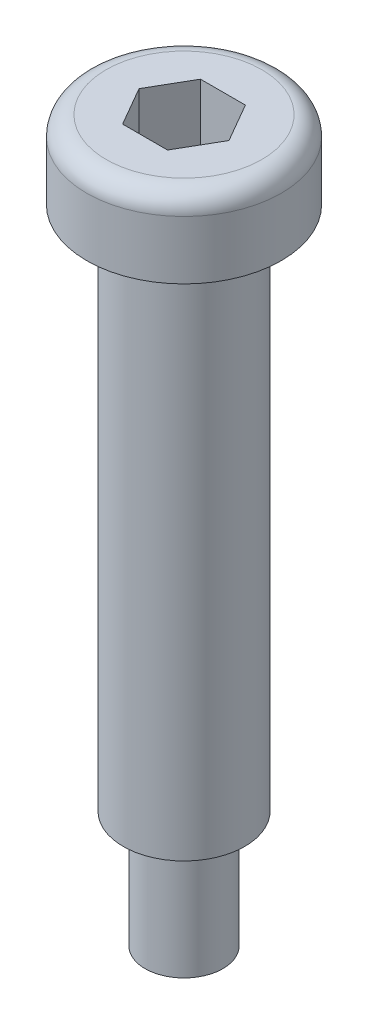
ISO-10303-21;
HEADER;
FILE_DESCRIPTION(('STEP AP214'),'2;1');
FILE_NAME('part.step','',(''),(''),'','','');
FILE_SCHEMA(('AUTOMOTIVE_DESIGN { 1 0 10303 214 1 1 1 1 }'));
ENDSEC;
DATA;
#1=APPLICATION_CONTEXT('core data for automotive mechanical design processes');
#2=APPLICATION_PROTOCOL_DEFINITION('international standard','automotive_design',2000,#1);
#3=PRODUCT_CONTEXT('',#1,'mechanical');
#4=PRODUCT('Part','Part','',(#3));
#5=PRODUCT_RELATED_PRODUCT_CATEGORY('part','',(#4));
#6=PRODUCT_DEFINITION_FORMATION('','',#4);
#7=PRODUCT_DEFINITION_CONTEXT('part definition',#1,'design');
#8=PRODUCT_DEFINITION('design','',#6,#7);
#9=PRODUCT_DEFINITION_SHAPE('','',#8);
#10=(LENGTH_UNIT() NAMED_UNIT(*) SI_UNIT(.MILLI.,.METRE.));
#11=(NAMED_UNIT(*) PLANE_ANGLE_UNIT() SI_UNIT($,.RADIAN.));
#12=(NAMED_UNIT(*) SI_UNIT($,.STERADIAN.) SOLID_ANGLE_UNIT());
#13=UNCERTAINTY_MEASURE_WITH_UNIT(LENGTH_MEASURE(1.E-05),#10,'distance_accuracy_value','');
#14=(GEOMETRIC_REPRESENTATION_CONTEXT(3) GLOBAL_UNCERTAINTY_ASSIGNED_CONTEXT((#13)) GLOBAL_UNIT_ASSIGNED_CONTEXT((#10,
#11,#12)) REPRESENTATION_CONTEXT('',''));
#15=CARTESIAN_POINT('',(0.,0.,0.));
#16=DIRECTION('',(0.,0.,1.));
#17=DIRECTION('',(1.,0.,0.));
#18=AXIS2_PLACEMENT_3D('',#15,#16,#17);
#19=CARTESIAN_POINT('',(-2.,0.,0.));
#20=DIRECTION('',(0.,1.,0.));
#21=DIRECTION('',(0.,0.,1.));
#22=AXIS2_PLACEMENT_3D('',#19,#20,#21);
#23=PLANE('',#22);
#24=CARTESIAN_POINT('',(0.,0.,0.));
#25=DIRECTION('',(0.,-1.,0.));
#26=DIRECTION('',(0.,0.,-1.));
#27=AXIS2_PLACEMENT_3D('',#24,#25,#26);
#28=CIRCLE('',#27,2.);
#29=CARTESIAN_POINT('',(0.,0.,-2.));
#30=VERTEX_POINT('',#29);
#31=EDGE_CURVE('E160',#30,#30,#28,.T.);
#32=ORIENTED_EDGE('',*,*,#31,.T.);
#33=EDGE_LOOP('',(#32));
#34=FACE_BOUND('',#33,.T.);
#35=ADVANCED_FACE('F45',(#34),#23,.F.);
#36=CARTESIAN_POINT('',(0.,37.,0.));
#37=DIRECTION('',(0.,-1.,0.));
#38=DIRECTION('',(0.,0.,-1.));
#39=AXIS2_PLACEMENT_3D('',#36,#37,#38);
#40=PLANE('',#39);
#41=CARTESIAN_POINT('',(0.,37.,0.));
#42=DIRECTION('',(0.,-1.,0.));
#43=DIRECTION('',(0.,0.,-1.));
#44=AXIS2_PLACEMENT_3D('',#41,#42,#43);
#45=CIRCLE('',#44,4.);
#46=CARTESIAN_POINT('',(0.,37.,-4.));
#47=VERTEX_POINT('',#46);
#48=EDGE_CURVE('E11',#47,#47,#45,.F.);
#49=ORIENTED_EDGE('',*,*,#48,.T.);
#50=EDGE_LOOP('',(#49));
#51=FACE_BOUND('',#50,.T.);
#52=DIRECTION('',(-1.,0.,0.));
#53=VECTOR('',#52,1.);
#54=CARTESIAN_POINT('',(1.15470053837925,37.,-2.));
#55=LINE('',#54,#53);
#56=CARTESIAN_POINT('',(1.15470053837925,37.,-2.));
#57=VERTEX_POINT('',#56);
#58=CARTESIAN_POINT('',(-1.15470053837925,37.,-2.));
#59=VERTEX_POINT('',#58);
#60=EDGE_CURVE('E141',#57,#59,#55,.T.);
#61=ORIENTED_EDGE('',*,*,#60,.F.);
#62=DIRECTION('',(-0.5,0.,-0.866025403784438));
#63=VECTOR('',#62,1.);
#64=CARTESIAN_POINT('',(2.3094010767585,37.,0.));
#65=LINE('',#64,#63);
#66=CARTESIAN_POINT('',(2.3094010767585,37.,0.));
#67=VERTEX_POINT('',#66);
#68=EDGE_CURVE('E61',#67,#57,#65,.T.);
#69=ORIENTED_EDGE('',*,*,#68,.F.);
#70=DIRECTION('',(0.5,0.,-0.866025403784439));
#71=VECTOR('',#70,1.);
#72=CARTESIAN_POINT('',(1.15470053837925,37.,2.));
#73=LINE('',#72,#71);
#74=CARTESIAN_POINT('',(1.15470053837925,37.,2.));
#75=VERTEX_POINT('',#74);
#76=EDGE_CURVE('E154',#75,#67,#73,.T.);
#77=ORIENTED_EDGE('',*,*,#76,.F.);
#78=DIRECTION('',(1.,0.,0.));
#79=VECTOR('',#78,1.);
#80=CARTESIAN_POINT('',(-1.15470053837925,37.,2.));
#81=LINE('',#80,#79);
#82=CARTESIAN_POINT('',(-1.15470053837925,37.,2.));
#83=VERTEX_POINT('',#82);
#84=EDGE_CURVE('E151',#83,#75,#81,.T.);
#85=ORIENTED_EDGE('',*,*,#84,.F.);
#86=DIRECTION('',(0.5,0.,0.866025403784439));
#87=VECTOR('',#86,1.);
#88=CARTESIAN_POINT('',(-2.3094010767585,37.,0.));
#89=LINE('',#88,#87);
#90=CARTESIAN_POINT('',(-2.3094010767585,37.,0.));
#91=VERTEX_POINT('',#90);
#92=EDGE_CURVE('E109',#91,#83,#89,.T.);
#93=ORIENTED_EDGE('',*,*,#92,.F.);
#94=DIRECTION('',(-0.5,0.,0.866025403784439));
#95=VECTOR('',#94,1.);
#96=CARTESIAN_POINT('',(-1.15470053837925,37.,-2.));
#97=LINE('',#96,#95);
#98=EDGE_CURVE('E145',#59,#91,#97,.T.);
#99=ORIENTED_EDGE('',*,*,#98,.F.);
#100=EDGE_LOOP('',(#61,#69,#77,#85,#93,#99));
#101=FACE_BOUND('',#100,.T.);
#102=ADVANCED_FACE('F205',(#51,#101),#40,.F.);
#103=CARTESIAN_POINT('',(0.,0.,0.));
#104=DIRECTION('',(0.,-1.,0.));
#105=DIRECTION('',(0.,0.,-1.));
#106=AXIS2_PLACEMENT_3D('',#103,#104,#105);
#107=CYLINDRICAL_SURFACE('',#106,5.);
#108=CARTESIAN_POINT('',(0.,36.,0.));
#109=DIRECTION('',(0.,-1.,0.));
#110=DIRECTION('',(0.,0.,-1.));
#111=AXIS2_PLACEMENT_3D('',#108,#109,#110);
#112=CIRCLE('',#111,5.);
#113=CARTESIAN_POINT('',(0.,36.,-5.));
#114=VERTEX_POINT('',#113);
#115=EDGE_CURVE('E54',#114,#114,#112,.T.);
#116=ORIENTED_EDGE('',*,*,#115,.T.);
#117=EDGE_LOOP('',(#116));
#118=FACE_BOUND('',#117,.T.);
#119=CARTESIAN_POINT('',(0.,33.,0.));
#120=DIRECTION('',(0.,-1.,0.));
#121=DIRECTION('',(0.,0.,-1.));
#122=AXIS2_PLACEMENT_3D('',#119,#120,#121);
#123=CIRCLE('',#122,5.);
#124=CARTESIAN_POINT('',(0.,33.,-5.));
#125=VERTEX_POINT('',#124);
#126=EDGE_CURVE('E185',#125,#125,#123,.T.);
#127=ORIENTED_EDGE('',*,*,#126,.F.);
#128=EDGE_LOOP('',(#127));
#129=FACE_BOUND('',#128,.T.);
#130=ADVANCED_FACE('F192',(#118,#129),#107,.T.);
#131=CARTESIAN_POINT('',(-5.,33.,0.));
#132=DIRECTION('',(0.,1.,0.));
#133=DIRECTION('',(0.,0.,1.));
#134=AXIS2_PLACEMENT_3D('',#131,#132,#133);
#135=PLANE('',#134);
#136=CARTESIAN_POINT('',(0.,33.,0.));
#137=DIRECTION('',(0.,-1.,0.));
#138=DIRECTION('',(0.,0.,-1.));
#139=AXIS2_PLACEMENT_3D('',#136,#137,#138);
#140=CIRCLE('',#139,3.125);
#141=CARTESIAN_POINT('',(0.,33.,-3.125));
#142=VERTEX_POINT('',#141);
#143=EDGE_CURVE('E181',#142,#142,#140,.T.);
#144=ORIENTED_EDGE('',*,*,#143,.F.);
#145=EDGE_LOOP('',(#144));
#146=FACE_BOUND('',#145,.T.);
#147=ORIENTED_EDGE('',*,*,#126,.T.);
#148=EDGE_LOOP('',(#147));
#149=FACE_BOUND('',#148,.T.);
#150=ADVANCED_FACE('F215',(#146,#149),#135,.F.);
#151=CARTESIAN_POINT('',(0.,0.,0.));
#152=DIRECTION('',(0.,-1.,0.));
#153=DIRECTION('',(0.,0.,-1.));
#154=AXIS2_PLACEMENT_3D('',#151,#152,#153);
#155=CYLINDRICAL_SURFACE('',#154,3.125);
#156=CARTESIAN_POINT('',(0.,6.,0.));
#157=DIRECTION('',(0.,-1.,0.));
#158=DIRECTION('',(0.,0.,-1.));
#159=AXIS2_PLACEMENT_3D('',#156,#157,#158);
#160=CIRCLE('',#159,3.125);
#161=CARTESIAN_POINT('',(0.,6.,-3.125));
#162=VERTEX_POINT('',#161);
#163=EDGE_CURVE('E177',#162,#162,#160,.T.);
#164=ORIENTED_EDGE('',*,*,#163,.F.);
#165=EDGE_LOOP('',(#164));
#166=FACE_BOUND('',#165,.T.);
#167=ORIENTED_EDGE('',*,*,#143,.T.);
#168=EDGE_LOOP('',(#167));
#169=FACE_BOUND('',#168,.T.);
#170=ADVANCED_FACE('F217',(#166,#169),#155,.T.);
#171=CARTESIAN_POINT('',(-2.,6.,0.));
#172=DIRECTION('',(0.,1.,0.));
#173=DIRECTION('',(0.,0.,1.));
#174=AXIS2_PLACEMENT_3D('',#171,#172,#173);
#175=PLANE('',#174);
#176=CARTESIAN_POINT('',(0.,6.,0.));
#177=DIRECTION('',(0.,-1.,0.));
#178=DIRECTION('',(0.,0.,-1.));
#179=AXIS2_PLACEMENT_3D('',#176,#177,#178);
#180=CIRCLE('',#179,2.);
#181=CARTESIAN_POINT('',(0.,6.,-2.));
#182=VERTEX_POINT('',#181);
#183=EDGE_CURVE('E173',#182,#182,#180,.T.);
#184=ORIENTED_EDGE('',*,*,#183,.F.);
#185=EDGE_LOOP('',(#184));
#186=FACE_BOUND('',#185,.T.);
#187=ORIENTED_EDGE('',*,*,#163,.T.);
#188=EDGE_LOOP('',(#187));
#189=FACE_BOUND('',#188,.T.);
#190=ADVANCED_FACE('F221',(#186,#189),#175,.F.);
#191=CARTESIAN_POINT('',(0.,0.,0.));
#192=DIRECTION('',(0.,-1.,0.));
#193=DIRECTION('',(0.,0.,-1.));
#194=AXIS2_PLACEMENT_3D('',#191,#192,#193);
#195=CYLINDRICAL_SURFACE('',#194,2.);
#196=ORIENTED_EDGE('',*,*,#31,.F.);
#197=EDGE_LOOP('',(#196));
#198=FACE_BOUND('',#197,.T.);
#199=ORIENTED_EDGE('',*,*,#183,.T.);
#200=EDGE_LOOP('',(#199));
#201=FACE_BOUND('',#200,.T.);
#202=ADVANCED_FACE('F225',(#198,#201),#195,.T.);
#203=CARTESIAN_POINT('',(2.3094010767585,34.,0.));
#204=DIRECTION('',(0.866025403784438,0.,-0.5));
#205=DIRECTION('',(-0.5,0.,-0.866025403784438));
#206=AXIS2_PLACEMENT_3D('',#203,#204,#205);
#207=PLANE('',#206);
#208=ORIENTED_EDGE('',*,*,#68,.T.);
#209=DIRECTION('',(0.,1.,0.));
#210=VECTOR('',#209,1.);
#211=CARTESIAN_POINT('',(1.15470053837925,34.,-2.));
#212=LINE('',#211,#210);
#213=CARTESIAN_POINT('',(1.15470053837925,34.,-2.));
#214=VERTEX_POINT('',#213);
#215=EDGE_CURVE('E91',#214,#57,#212,.T.);
#216=ORIENTED_EDGE('',*,*,#215,.F.);
#217=DIRECTION('',(-0.5,0.,-0.866025403784438));
#218=VECTOR('',#217,1.);
#219=CARTESIAN_POINT('',(2.3094010767585,34.,0.));
#220=LINE('',#219,#218);
#221=CARTESIAN_POINT('',(2.3094010767585,34.,0.));
#222=VERTEX_POINT('',#221);
#223=EDGE_CURVE('E157',#222,#214,#220,.T.);
#224=ORIENTED_EDGE('',*,*,#223,.F.);
#225=DIRECTION('',(0.,1.,0.));
#226=VECTOR('',#225,1.);
#227=CARTESIAN_POINT('',(2.3094010767585,34.,0.));
#228=LINE('',#227,#226);
#229=EDGE_CURVE('E69',#222,#67,#228,.T.);
#230=ORIENTED_EDGE('',*,*,#229,.T.);
#231=EDGE_LOOP('',(#208,#216,#224,#230));
#232=FACE_BOUND('',#231,.T.);
#233=ADVANCED_FACE('F229',(#232),#207,.F.);
#234=CARTESIAN_POINT('',(1.15470053837925,34.,2.));
#235=DIRECTION('',(0.866025403784439,0.,0.5));
#236=DIRECTION('',(0.5,0.,-0.866025403784439));
#237=AXIS2_PLACEMENT_3D('',#234,#235,#236);
#238=PLANE('',#237);
#239=ORIENTED_EDGE('',*,*,#76,.T.);
#240=ORIENTED_EDGE('',*,*,#229,.F.);
#241=DIRECTION('',(0.5,0.,-0.866025403784439));
#242=VECTOR('',#241,1.);
#243=CARTESIAN_POINT('',(1.15470053837925,34.,2.));
#244=LINE('',#243,#242);
#245=CARTESIAN_POINT('',(1.15470053837925,34.,2.));
#246=VERTEX_POINT('',#245);
#247=EDGE_CURVE('E123',#246,#222,#244,.T.);
#248=ORIENTED_EDGE('',*,*,#247,.F.);
#249=DIRECTION('',(0.,1.,0.));
#250=VECTOR('',#249,1.);
#251=CARTESIAN_POINT('',(1.15470053837925,34.,2.));
#252=LINE('',#251,#250);
#253=EDGE_CURVE('E114',#246,#75,#252,.T.);
#254=ORIENTED_EDGE('',*,*,#253,.T.);
#255=EDGE_LOOP('',(#239,#240,#248,#254));
#256=FACE_BOUND('',#255,.T.);
#257=ADVANCED_FACE('F233',(#256),#238,.F.);
#258=CARTESIAN_POINT('',(-1.15470053837925,34.,2.));
#259=DIRECTION('',(0.,0.,1.));
#260=DIRECTION('',(1.,0.,0.));
#261=AXIS2_PLACEMENT_3D('',#258,#259,#260);
#262=PLANE('',#261);
#263=ORIENTED_EDGE('',*,*,#84,.T.);
#264=ORIENTED_EDGE('',*,*,#253,.F.);
#265=DIRECTION('',(1.,0.,0.));
#266=VECTOR('',#265,1.);
#267=CARTESIAN_POINT('',(-1.15470053837925,34.,2.));
#268=LINE('',#267,#266);
#269=CARTESIAN_POINT('',(-1.15470053837925,34.,2.));
#270=VERTEX_POINT('',#269);
#271=EDGE_CURVE('E118',#270,#246,#268,.T.);
#272=ORIENTED_EDGE('',*,*,#271,.F.);
#273=DIRECTION('',(0.,1.,0.));
#274=VECTOR('',#273,1.);
#275=CARTESIAN_POINT('',(-1.15470053837925,34.,2.));
#276=LINE('',#275,#274);
#277=EDGE_CURVE('E102',#270,#83,#276,.T.);
#278=ORIENTED_EDGE('',*,*,#277,.T.);
#279=EDGE_LOOP('',(#263,#264,#272,#278));
#280=FACE_BOUND('',#279,.T.);
#281=ADVANCED_FACE('F119',(#280),#262,.F.);
#282=CARTESIAN_POINT('',(-2.3094010767585,34.,0.));
#283=DIRECTION('',(-0.866025403784439,0.,0.5));
#284=DIRECTION('',(0.5,0.,0.866025403784439));
#285=AXIS2_PLACEMENT_3D('',#282,#283,#284);
#286=PLANE('',#285);
#287=ORIENTED_EDGE('',*,*,#92,.T.);
#288=ORIENTED_EDGE('',*,*,#277,.F.);
#289=DIRECTION('',(0.5,0.,0.866025403784439));
#290=VECTOR('',#289,1.);
#291=CARTESIAN_POINT('',(-2.3094010767585,34.,0.));
#292=LINE('',#291,#290);
#293=CARTESIAN_POINT('',(-2.3094010767585,34.,0.));
#294=VERTEX_POINT('',#293);
#295=EDGE_CURVE('E106',#294,#270,#292,.T.);
#296=ORIENTED_EDGE('',*,*,#295,.F.);
#297=DIRECTION('',(0.,1.,0.));
#298=VECTOR('',#297,1.);
#299=CARTESIAN_POINT('',(-2.3094010767585,34.,0.));
#300=LINE('',#299,#298);
#301=EDGE_CURVE('E115',#294,#91,#300,.T.);
#302=ORIENTED_EDGE('',*,*,#301,.T.);
#303=EDGE_LOOP('',(#287,#288,#296,#302));
#304=FACE_BOUND('',#303,.T.);
#305=ADVANCED_FACE('F104',(#304),#286,.F.);
#306=CARTESIAN_POINT('',(-1.15470053837925,34.,-2.));
#307=DIRECTION('',(-0.866025403784439,0.,-0.5));
#308=DIRECTION('',(-0.5,0.,0.866025403784439));
#309=AXIS2_PLACEMENT_3D('',#306,#307,#308);
#310=PLANE('',#309);
#311=ORIENTED_EDGE('',*,*,#98,.T.);
#312=ORIENTED_EDGE('',*,*,#301,.F.);
#313=DIRECTION('',(-0.5,0.,0.866025403784439));
#314=VECTOR('',#313,1.);
#315=CARTESIAN_POINT('',(-1.15470053837925,34.,-2.));
#316=LINE('',#315,#314);
#317=CARTESIAN_POINT('',(-1.15470053837925,34.,-2.));
#318=VERTEX_POINT('',#317);
#319=EDGE_CURVE('E129',#318,#294,#316,.T.);
#320=ORIENTED_EDGE('',*,*,#319,.F.);
#321=DIRECTION('',(0.,1.,0.));
#322=VECTOR('',#321,1.);
#323=CARTESIAN_POINT('',(-1.15470053837925,34.,-2.));
#324=LINE('',#323,#322);
#325=EDGE_CURVE('E165',#318,#59,#324,.T.);
#326=ORIENTED_EDGE('',*,*,#325,.T.);
#327=EDGE_LOOP('',(#311,#312,#320,#326));
#328=FACE_BOUND('',#327,.T.);
#329=ADVANCED_FACE('F236',(#328),#310,.F.);
#330=CARTESIAN_POINT('',(1.15470053837925,34.,-2.));
#331=DIRECTION('',(0.,0.,-1.));
#332=DIRECTION('',(-1.,0.,0.));
#333=AXIS2_PLACEMENT_3D('',#330,#331,#332);
#334=PLANE('',#333);
#335=ORIENTED_EDGE('',*,*,#60,.T.);
#336=ORIENTED_EDGE('',*,*,#325,.F.);
#337=DIRECTION('',(-1.,0.,0.));
#338=VECTOR('',#337,1.);
#339=CARTESIAN_POINT('',(1.15470053837925,34.,-2.));
#340=LINE('',#339,#338);
#341=EDGE_CURVE('E133',#214,#318,#340,.T.);
#342=ORIENTED_EDGE('',*,*,#341,.F.);
#343=ORIENTED_EDGE('',*,*,#215,.T.);
#344=EDGE_LOOP('',(#335,#336,#342,#343));
#345=FACE_BOUND('',#344,.T.);
#346=ADVANCED_FACE('F201',(#345),#334,.F.);
#347=CARTESIAN_POINT('',(0.,34.,0.));
#348=DIRECTION('',(0.,1.,0.));
#349=DIRECTION('',(0.,0.,1.));
#350=AXIS2_PLACEMENT_3D('',#347,#348,#349);
#351=PLANE('',#350);
#352=ORIENTED_EDGE('',*,*,#223,.T.);
#353=ORIENTED_EDGE('',*,*,#341,.T.);
#354=ORIENTED_EDGE('',*,*,#319,.T.);
#355=ORIENTED_EDGE('',*,*,#295,.T.);
#356=ORIENTED_EDGE('',*,*,#271,.T.);
#357=ORIENTED_EDGE('',*,*,#247,.T.);
#358=EDGE_LOOP('',(#352,#353,#354,#355,#356,#357));
#359=FACE_BOUND('',#358,.T.);
#360=ADVANCED_FACE('F126',(#359),#351,.T.);
#361=CARTESIAN_POINT('',(0.,36.,0.));
#362=DIRECTION('',(0.,-1.,0.));
#363=DIRECTION('',(0.,0.,-1.));
#364=AXIS2_PLACEMENT_3D('',#361,#362,#363);
#365=TOROIDAL_SURFACE('',#364,4.,1.);
#366=ORIENTED_EDGE('',*,*,#48,.F.);
#367=EDGE_LOOP('',(#366));
#368=FACE_BOUND('',#367,.T.);
#369=ORIENTED_EDGE('',*,*,#115,.F.);
#370=EDGE_LOOP('',(#369));
#371=FACE_BOUND('',#370,.T.);
#372=ADVANCED_FACE('F47',(#368,#371),#365,.T.);
#373=CLOSED_SHELL('',(#35,#102,#130,#150,#170,#190,#202,#233,#257,#281,#305,#329,#346,#360,#372));
#374=MANIFOLD_SOLID_BREP('B2',#373);
#375=ADVANCED_BREP_SHAPE_REPRESENTATION('',(#18,#374),#14);
#376=SHAPE_DEFINITION_REPRESENTATION(#9,#375);
ENDSEC;
END-ISO-10303-21;
